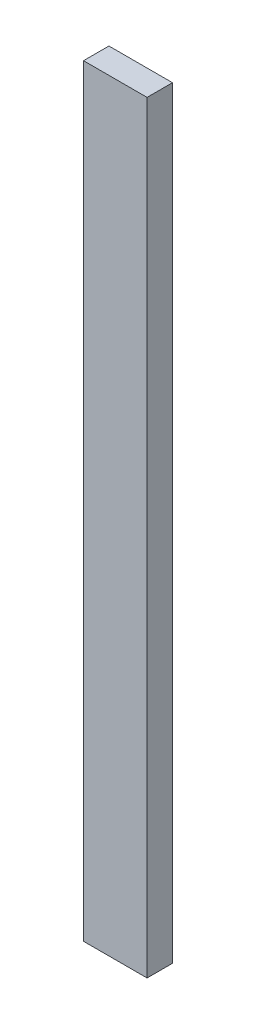
ISO-10303-21;
HEADER;
FILE_DESCRIPTION(('STEP AP214'),'2;1');
FILE_NAME('part.step','',(''),(''),'','','');
FILE_SCHEMA(('AUTOMOTIVE_DESIGN { 1 0 10303 214 1 1 1 1 }'));
ENDSEC;
DATA;
#1=APPLICATION_CONTEXT('core data for automotive mechanical design processes');
#2=APPLICATION_PROTOCOL_DEFINITION('international standard','automotive_design',2000,#1);
#3=PRODUCT_CONTEXT('',#1,'mechanical');
#4=PRODUCT('Part','Part','',(#3));
#5=PRODUCT_RELATED_PRODUCT_CATEGORY('part','',(#4));
#6=PRODUCT_DEFINITION_FORMATION('','',#4);
#7=PRODUCT_DEFINITION_CONTEXT('part definition',#1,'design');
#8=PRODUCT_DEFINITION('design','',#6,#7);
#9=PRODUCT_DEFINITION_SHAPE('','',#8);
#10=(LENGTH_UNIT() NAMED_UNIT(*) SI_UNIT(.MILLI.,.METRE.));
#11=(NAMED_UNIT(*) PLANE_ANGLE_UNIT() SI_UNIT($,.RADIAN.));
#12=(NAMED_UNIT(*) SI_UNIT($,.STERADIAN.) SOLID_ANGLE_UNIT());
#13=UNCERTAINTY_MEASURE_WITH_UNIT(LENGTH_MEASURE(1.E-05),#10,'distance_accuracy_value','');
#14=(GEOMETRIC_REPRESENTATION_CONTEXT(3) GLOBAL_UNCERTAINTY_ASSIGNED_CONTEXT((#13)) GLOBAL_UNIT_ASSIGNED_CONTEXT((#10,
#11,#12)) REPRESENTATION_CONTEXT('',''));
#15=CARTESIAN_POINT('',(0.,0.,0.));
#16=DIRECTION('',(0.,0.,1.));
#17=DIRECTION('',(1.,0.,0.));
#18=AXIS2_PLACEMENT_3D('',#15,#16,#17);
#19=CARTESIAN_POINT('',(-25.,300.,10.));
#20=DIRECTION('',(1.,0.,0.));
#21=DIRECTION('',(0.,0.,-1.));
#22=AXIS2_PLACEMENT_3D('',#19,#20,#21);
#23=PLANE('',#22);
#24=DIRECTION('',(0.,0.,1.));
#25=VECTOR('',#24,1.);
#26=CARTESIAN_POINT('',(-25.,-300.,10.));
#27=LINE('',#26,#25);
#28=CARTESIAN_POINT('',(-25.,-300.,-10.));
#29=VERTEX_POINT('',#28);
#30=CARTESIAN_POINT('',(-25.,-300.,10.));
#31=VERTEX_POINT('',#30);
#32=EDGE_CURVE('E100',#29,#31,#27,.T.);
#33=ORIENTED_EDGE('',*,*,#32,.T.);
#34=DIRECTION('',(0.,-1.,0.));
#35=VECTOR('',#34,1.);
#36=CARTESIAN_POINT('',(-25.,300.,10.));
#37=LINE('',#36,#35);
#38=CARTESIAN_POINT('',(-25.,300.,10.));
#39=VERTEX_POINT('',#38);
#40=EDGE_CURVE('E11',#39,#31,#37,.T.);
#41=ORIENTED_EDGE('',*,*,#40,.F.);
#42=DIRECTION('',(0.,0.,1.));
#43=VECTOR('',#42,1.);
#44=CARTESIAN_POINT('',(-25.,300.,10.));
#45=LINE('',#44,#43);
#46=CARTESIAN_POINT('',(-25.,300.,-10.));
#47=VERTEX_POINT('',#46);
#48=EDGE_CURVE('E88',#47,#39,#45,.T.);
#49=ORIENTED_EDGE('',*,*,#48,.F.);
#50=DIRECTION('',(0.,-1.,0.));
#51=VECTOR('',#50,1.);
#52=CARTESIAN_POINT('',(-25.,300.,-10.));
#53=LINE('',#52,#51);
#54=EDGE_CURVE('E96',#47,#29,#53,.T.);
#55=ORIENTED_EDGE('',*,*,#54,.T.);
#56=EDGE_LOOP('',(#33,#41,#49,#55));
#57=FACE_BOUND('',#56,.T.);
#58=ADVANCED_FACE('F37',(#57),#23,.F.);
#59=CARTESIAN_POINT('',(25.,300.,10.));
#60=DIRECTION('',(0.,0.,-1.));
#61=DIRECTION('',(-1.,0.,0.));
#62=AXIS2_PLACEMENT_3D('',#59,#60,#61);
#63=PLANE('',#62);
#64=DIRECTION('',(1.,0.,0.));
#65=VECTOR('',#64,1.);
#66=CARTESIAN_POINT('',(25.,-300.,10.));
#67=LINE('',#66,#65);
#68=CARTESIAN_POINT('',(25.,-300.,10.));
#69=VERTEX_POINT('',#68);
#70=EDGE_CURVE('E92',#31,#69,#67,.T.);
#71=ORIENTED_EDGE('',*,*,#70,.T.);
#72=DIRECTION('',(0.,-1.,0.));
#73=VECTOR('',#72,1.);
#74=CARTESIAN_POINT('',(25.,300.,10.));
#75=LINE('',#74,#73);
#76=CARTESIAN_POINT('',(25.,300.,10.));
#77=VERTEX_POINT('',#76);
#78=EDGE_CURVE('E45',#77,#69,#75,.T.);
#79=ORIENTED_EDGE('',*,*,#78,.F.);
#80=DIRECTION('',(1.,0.,0.));
#81=VECTOR('',#80,1.);
#82=CARTESIAN_POINT('',(25.,300.,10.));
#83=LINE('',#82,#81);
#84=EDGE_CURVE('E83',#39,#77,#83,.T.);
#85=ORIENTED_EDGE('',*,*,#84,.F.);
#86=ORIENTED_EDGE('',*,*,#40,.T.);
#87=EDGE_LOOP('',(#71,#79,#85,#86));
#88=FACE_BOUND('',#87,.T.);
#89=ADVANCED_FACE('F91',(#88),#63,.F.);
#90=CARTESIAN_POINT('',(25.,300.,10.));
#91=DIRECTION('',(-1.,0.,0.));
#92=DIRECTION('',(0.,0.,1.));
#93=AXIS2_PLACEMENT_3D('',#90,#91,#92);
#94=PLANE('',#93);
#95=DIRECTION('',(0.,0.,-1.));
#96=VECTOR('',#95,1.);
#97=CARTESIAN_POINT('',(25.,-300.,10.));
#98=LINE('',#97,#96);
#99=CARTESIAN_POINT('',(25.,-300.,-10.));
#100=VERTEX_POINT('',#99);
#101=EDGE_CURVE('E70',#69,#100,#98,.T.);
#102=ORIENTED_EDGE('',*,*,#101,.T.);
#103=DIRECTION('',(0.,-1.,0.));
#104=VECTOR('',#103,1.);
#105=CARTESIAN_POINT('',(25.,300.,-10.));
#106=LINE('',#105,#104);
#107=CARTESIAN_POINT('',(25.,300.,-10.));
#108=VERTEX_POINT('',#107);
#109=EDGE_CURVE('E93',#108,#100,#106,.T.);
#110=ORIENTED_EDGE('',*,*,#109,.F.);
#111=DIRECTION('',(0.,0.,-1.));
#112=VECTOR('',#111,1.);
#113=CARTESIAN_POINT('',(25.,300.,10.));
#114=LINE('',#113,#112);
#115=EDGE_CURVE('E86',#77,#108,#114,.T.);
#116=ORIENTED_EDGE('',*,*,#115,.F.);
#117=ORIENTED_EDGE('',*,*,#78,.T.);
#118=EDGE_LOOP('',(#102,#110,#116,#117));
#119=FACE_BOUND('',#118,.T.);
#120=ADVANCED_FACE('F94',(#119),#94,.F.);
#121=CARTESIAN_POINT('',(25.,300.,-10.));
#122=DIRECTION('',(0.,0.,1.));
#123=DIRECTION('',(1.,0.,0.));
#124=AXIS2_PLACEMENT_3D('',#121,#122,#123);
#125=PLANE('',#124);
#126=DIRECTION('',(-1.,0.,0.));
#127=VECTOR('',#126,1.);
#128=CARTESIAN_POINT('',(25.,-300.,-10.));
#129=LINE('',#128,#127);
#130=EDGE_CURVE('E76',#100,#29,#129,.T.);
#131=ORIENTED_EDGE('',*,*,#130,.T.);
#132=ORIENTED_EDGE('',*,*,#54,.F.);
#133=DIRECTION('',(-1.,0.,0.));
#134=VECTOR('',#133,1.);
#135=CARTESIAN_POINT('',(25.,300.,-10.));
#136=LINE('',#135,#134);
#137=EDGE_CURVE('E53',#108,#47,#136,.T.);
#138=ORIENTED_EDGE('',*,*,#137,.F.);
#139=ORIENTED_EDGE('',*,*,#109,.T.);
#140=EDGE_LOOP('',(#131,#132,#138,#139));
#141=FACE_BOUND('',#140,.T.);
#142=ADVANCED_FACE('F107',(#141),#125,.F.);
#143=CARTESIAN_POINT('',(0.,300.,0.));
#144=DIRECTION('',(0.,1.,0.));
#145=DIRECTION('',(0.,0.,1.));
#146=AXIS2_PLACEMENT_3D('',#143,#144,#145);
#147=PLANE('',#146);
#148=ORIENTED_EDGE('',*,*,#48,.T.);
#149=ORIENTED_EDGE('',*,*,#84,.T.);
#150=ORIENTED_EDGE('',*,*,#115,.T.);
#151=ORIENTED_EDGE('',*,*,#137,.T.);
#152=EDGE_LOOP('',(#148,#149,#150,#151));
#153=FACE_BOUND('',#152,.T.);
#154=ADVANCED_FACE('F84',(#153),#147,.T.);
#155=CARTESIAN_POINT('',(0.,-300.,0.));
#156=DIRECTION('',(0.,1.,0.));
#157=DIRECTION('',(0.,0.,1.));
#158=AXIS2_PLACEMENT_3D('',#155,#156,#157);
#159=PLANE('',#158);
#160=ORIENTED_EDGE('',*,*,#32,.F.);
#161=ORIENTED_EDGE('',*,*,#130,.F.);
#162=ORIENTED_EDGE('',*,*,#101,.F.);
#163=ORIENTED_EDGE('',*,*,#70,.F.);
#164=EDGE_LOOP('',(#160,#161,#162,#163));
#165=FACE_BOUND('',#164,.T.);
#166=ADVANCED_FACE('F110',(#165),#159,.F.);
#167=CLOSED_SHELL('',(#58,#89,#120,#142,#154,#166));
#168=MANIFOLD_SOLID_BREP('B2',#167);
#169=ADVANCED_BREP_SHAPE_REPRESENTATION('',(#18,#168),#14);
#170=SHAPE_DEFINITION_REPRESENTATION(#9,#169);
ENDSEC;
END-ISO-10303-21;
